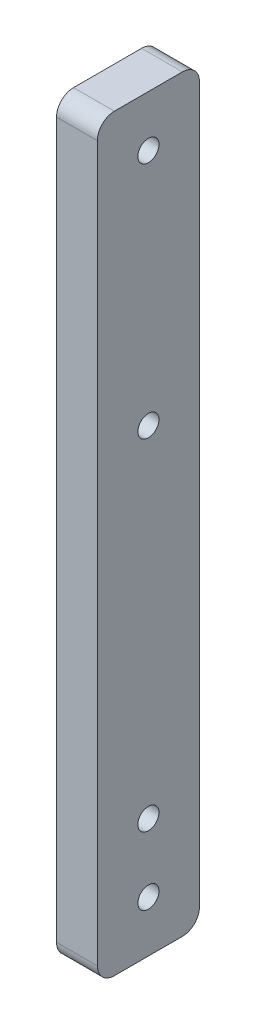
ISO-10303-21;
HEADER;
FILE_DESCRIPTION(('STEP AP214'),'2;1');
FILE_NAME('part.step','',(''),(''),'','','');
FILE_SCHEMA(('AUTOMOTIVE_DESIGN { 1 0 10303 214 1 1 1 1 }'));
ENDSEC;
DATA;
#1=APPLICATION_CONTEXT('core data for automotive mechanical design processes');
#2=APPLICATION_PROTOCOL_DEFINITION('international standard','automotive_design',2000,#1);
#3=PRODUCT_CONTEXT('',#1,'mechanical');
#4=PRODUCT('Part','Part','',(#3));
#5=PRODUCT_RELATED_PRODUCT_CATEGORY('part','',(#4));
#6=PRODUCT_DEFINITION_FORMATION('','',#4);
#7=PRODUCT_DEFINITION_CONTEXT('part definition',#1,'design');
#8=PRODUCT_DEFINITION('design','',#6,#7);
#9=PRODUCT_DEFINITION_SHAPE('','',#8);
#10=(LENGTH_UNIT() NAMED_UNIT(*) SI_UNIT(.MILLI.,.METRE.));
#11=(NAMED_UNIT(*) PLANE_ANGLE_UNIT() SI_UNIT($,.RADIAN.));
#12=(NAMED_UNIT(*) SI_UNIT($,.STERADIAN.) SOLID_ANGLE_UNIT());
#13=UNCERTAINTY_MEASURE_WITH_UNIT(LENGTH_MEASURE(1.E-05),#10,'distance_accuracy_value','');
#14=(GEOMETRIC_REPRESENTATION_CONTEXT(3) GLOBAL_UNCERTAINTY_ASSIGNED_CONTEXT((#13)) GLOBAL_UNIT_ASSIGNED_CONTEXT((#10,
#11,#12)) REPRESENTATION_CONTEXT('',''));
#15=CARTESIAN_POINT('',(0.,0.,0.));
#16=DIRECTION('',(0.,0.,1.));
#17=DIRECTION('',(1.,0.,0.));
#18=AXIS2_PLACEMENT_3D('',#15,#16,#17);
#19=CARTESIAN_POINT('',(12.,0.,0.));
#20=DIRECTION('',(1.,0.,0.));
#21=DIRECTION('',(0.,0.,-1.));
#22=AXIS2_PLACEMENT_3D('',#19,#20,#21);
#23=PLANE('',#22);
#24=CARTESIAN_POINT('',(12.,120.,0.));
#25=DIRECTION('',(1.,0.,0.));
#26=DIRECTION('',(0.,0.,-1.));
#27=AXIS2_PLACEMENT_3D('',#24,#25,#26);
#28=CIRCLE('',#27,3.1);
#29=CARTESIAN_POINT('',(12.,120.,-3.1));
#30=VERTEX_POINT('',#29);
#31=EDGE_CURVE('E230',#30,#30,#28,.T.);
#32=ORIENTED_EDGE('',*,*,#31,.F.);
#33=EDGE_LOOP('',(#32));
#34=FACE_BOUND('',#33,.T.);
#35=CARTESIAN_POINT('',(12.,0.,0.));
#36=DIRECTION('',(1.,0.,0.));
#37=DIRECTION('',(0.,0.,-1.));
#38=AXIS2_PLACEMENT_3D('',#35,#36,#37);
#39=CIRCLE('',#38,3.1);
#40=CARTESIAN_POINT('',(12.,0.,-3.1));
#41=VERTEX_POINT('',#40);
#42=EDGE_CURVE('E147',#41,#41,#39,.T.);
#43=ORIENTED_EDGE('',*,*,#42,.F.);
#44=EDGE_LOOP('',(#43));
#45=FACE_BOUND('',#44,.T.);
#46=DIRECTION('',(0.,-1.,0.));
#47=VECTOR('',#46,1.);
#48=CARTESIAN_POINT('',(12.,205.,15.));
#49=LINE('',#48,#47);
#50=CARTESIAN_POINT('',(12.,200.,15.));
#51=VERTEX_POINT('',#50);
#52=CARTESIAN_POINT('',(12.,-10.,15.));
#53=VERTEX_POINT('',#52);
#54=EDGE_CURVE('E153',#51,#53,#49,.T.);
#55=ORIENTED_EDGE('',*,*,#54,.T.);
#56=CARTESIAN_POINT('',(12.,-10.,9.99999999999998));
#57=DIRECTION('',(1.,0.,0.));
#58=DIRECTION('',(0.,0.,-1.));
#59=AXIS2_PLACEMENT_3D('',#56,#57,#58);
#60=CIRCLE('',#59,5.);
#61=CARTESIAN_POINT('',(12.,-15.,9.99999999999998));
#62=VERTEX_POINT('',#61);
#63=EDGE_CURVE('E177',#53,#62,#60,.T.);
#64=ORIENTED_EDGE('',*,*,#63,.T.);
#65=DIRECTION('',(0.,0.,-1.));
#66=VECTOR('',#65,1.);
#67=CARTESIAN_POINT('',(12.,-15.,15.));
#68=LINE('',#67,#66);
#69=CARTESIAN_POINT('',(12.,-15.,-9.99999999999999));
#70=VERTEX_POINT('',#69);
#71=EDGE_CURVE('E130',#62,#70,#68,.T.);
#72=ORIENTED_EDGE('',*,*,#71,.T.);
#73=CARTESIAN_POINT('',(12.,-10.,-9.99999999999999));
#74=DIRECTION('',(1.,0.,0.));
#75=DIRECTION('',(0.,0.,-1.));
#76=AXIS2_PLACEMENT_3D('',#73,#74,#75);
#77=CIRCLE('',#76,5.);
#78=CARTESIAN_POINT('',(12.,-10.,-15.));
#79=VERTEX_POINT('',#78);
#80=EDGE_CURVE('E174',#70,#79,#77,.T.);
#81=ORIENTED_EDGE('',*,*,#80,.T.);
#82=DIRECTION('',(0.,1.,0.));
#83=VECTOR('',#82,1.);
#84=CARTESIAN_POINT('',(12.,205.,-15.));
#85=LINE('',#84,#83);
#86=CARTESIAN_POINT('',(12.,200.,-15.));
#87=VERTEX_POINT('',#86);
#88=EDGE_CURVE('E203',#79,#87,#85,.T.);
#89=ORIENTED_EDGE('',*,*,#88,.T.);
#90=CARTESIAN_POINT('',(12.,200.,-10.));
#91=DIRECTION('',(1.,0.,0.));
#92=DIRECTION('',(0.,0.,-1.));
#93=AXIS2_PLACEMENT_3D('',#90,#91,#92);
#94=CIRCLE('',#93,5.);
#95=CARTESIAN_POINT('',(12.,205.,-10.));
#96=VERTEX_POINT('',#95);
#97=EDGE_CURVE('E64',#87,#96,#94,.T.);
#98=ORIENTED_EDGE('',*,*,#97,.T.);
#99=DIRECTION('',(0.,0.,1.));
#100=VECTOR('',#99,1.);
#101=CARTESIAN_POINT('',(12.,205.,15.));
#102=LINE('',#101,#100);
#103=CARTESIAN_POINT('',(12.,205.,10.));
#104=VERTEX_POINT('',#103);
#105=EDGE_CURVE('E155',#96,#104,#102,.T.);
#106=ORIENTED_EDGE('',*,*,#105,.T.);
#107=CARTESIAN_POINT('',(12.,200.,10.));
#108=DIRECTION('',(1.,0.,0.));
#109=DIRECTION('',(0.,0.,-1.));
#110=AXIS2_PLACEMENT_3D('',#107,#108,#109);
#111=CIRCLE('',#110,5.);
#112=EDGE_CURVE('E171',#104,#51,#111,.T.);
#113=ORIENTED_EDGE('',*,*,#112,.T.);
#114=EDGE_LOOP('',(#55,#64,#72,#81,#89,#98,#106,#113));
#115=FACE_BOUND('',#114,.T.);
#116=CARTESIAN_POINT('',(12.,20.,0.));
#117=DIRECTION('',(1.,0.,0.));
#118=DIRECTION('',(0.,0.,-1.));
#119=AXIS2_PLACEMENT_3D('',#116,#117,#118);
#120=CIRCLE('',#119,3.1);
#121=CARTESIAN_POINT('',(12.,20.,-3.1));
#122=VERTEX_POINT('',#121);
#123=EDGE_CURVE('E218',#122,#122,#120,.T.);
#124=ORIENTED_EDGE('',*,*,#123,.F.);
#125=EDGE_LOOP('',(#124));
#126=FACE_BOUND('',#125,.T.);
#127=CARTESIAN_POINT('',(12.,190.,0.));
#128=DIRECTION('',(1.,0.,0.));
#129=DIRECTION('',(0.,0.,-1.));
#130=AXIS2_PLACEMENT_3D('',#127,#128,#129);
#131=CIRCLE('',#130,3.1);
#132=CARTESIAN_POINT('',(12.,190.,-3.1));
#133=VERTEX_POINT('',#132);
#134=EDGE_CURVE('E221',#133,#133,#131,.T.);
#135=ORIENTED_EDGE('',*,*,#134,.F.);
#136=EDGE_LOOP('',(#135));
#137=FACE_BOUND('',#136,.T.);
#138=ADVANCED_FACE('F43',(#34,#45,#115,#126,#137),#23,.T.);
#139=CARTESIAN_POINT('',(0.,0.,0.));
#140=DIRECTION('',(1.,0.,0.));
#141=DIRECTION('',(0.,0.,-1.));
#142=AXIS2_PLACEMENT_3D('',#139,#140,#141);
#143=PLANE('',#142);
#144=DIRECTION('',(0.,0.,-1.));
#145=VECTOR('',#144,1.);
#146=CARTESIAN_POINT('',(0.,-15.,15.));
#147=LINE('',#146,#145);
#148=CARTESIAN_POINT('',(0.,-15.,9.99999999999998));
#149=VERTEX_POINT('',#148);
#150=CARTESIAN_POINT('',(0.,-15.,-9.99999999999999));
#151=VERTEX_POINT('',#150);
#152=EDGE_CURVE('E127',#149,#151,#147,.T.);
#153=ORIENTED_EDGE('',*,*,#152,.F.);
#154=CARTESIAN_POINT('',(0.,-10.,9.99999999999998));
#155=DIRECTION('',(1.,0.,0.));
#156=DIRECTION('',(0.,0.,-1.));
#157=AXIS2_PLACEMENT_3D('',#154,#155,#156);
#158=CIRCLE('',#157,5.);
#159=CARTESIAN_POINT('',(0.,-10.,15.));
#160=VERTEX_POINT('',#159);
#161=EDGE_CURVE('E109',#149,#160,#158,.F.);
#162=ORIENTED_EDGE('',*,*,#161,.T.);
#163=DIRECTION('',(0.,-1.,0.));
#164=VECTOR('',#163,1.);
#165=CARTESIAN_POINT('',(0.,205.,15.));
#166=LINE('',#165,#164);
#167=CARTESIAN_POINT('',(0.,200.,15.));
#168=VERTEX_POINT('',#167);
#169=EDGE_CURVE('E140',#168,#160,#166,.T.);
#170=ORIENTED_EDGE('',*,*,#169,.F.);
#171=CARTESIAN_POINT('',(0.,200.,10.));
#172=DIRECTION('',(1.,0.,0.));
#173=DIRECTION('',(0.,0.,-1.));
#174=AXIS2_PLACEMENT_3D('',#171,#172,#173);
#175=CIRCLE('',#174,5.);
#176=CARTESIAN_POINT('',(0.,205.,10.));
#177=VERTEX_POINT('',#176);
#178=EDGE_CURVE('E159',#168,#177,#175,.F.);
#179=ORIENTED_EDGE('',*,*,#178,.T.);
#180=DIRECTION('',(0.,0.,1.));
#181=VECTOR('',#180,1.);
#182=CARTESIAN_POINT('',(0.,205.,15.));
#183=LINE('',#182,#181);
#184=CARTESIAN_POINT('',(0.,205.,-10.));
#185=VERTEX_POINT('',#184);
#186=EDGE_CURVE('E145',#185,#177,#183,.T.);
#187=ORIENTED_EDGE('',*,*,#186,.F.);
#188=CARTESIAN_POINT('',(0.,200.,-10.));
#189=DIRECTION('',(1.,0.,0.));
#190=DIRECTION('',(0.,0.,-1.));
#191=AXIS2_PLACEMENT_3D('',#188,#189,#190);
#192=CIRCLE('',#191,5.);
#193=CARTESIAN_POINT('',(0.,200.,-15.));
#194=VERTEX_POINT('',#193);
#195=EDGE_CURVE('E132',#185,#194,#192,.F.);
#196=ORIENTED_EDGE('',*,*,#195,.T.);
#197=DIRECTION('',(0.,1.,0.));
#198=VECTOR('',#197,1.);
#199=CARTESIAN_POINT('',(0.,205.,-15.));
#200=LINE('',#199,#198);
#201=CARTESIAN_POINT('',(0.,-10.,-15.));
#202=VERTEX_POINT('',#201);
#203=EDGE_CURVE('E139',#202,#194,#200,.T.);
#204=ORIENTED_EDGE('',*,*,#203,.F.);
#205=CARTESIAN_POINT('',(0.,-10.,-9.99999999999999));
#206=DIRECTION('',(1.,0.,0.));
#207=DIRECTION('',(0.,0.,-1.));
#208=AXIS2_PLACEMENT_3D('',#205,#206,#207);
#209=CIRCLE('',#208,5.);
#210=EDGE_CURVE('E121',#202,#151,#209,.F.);
#211=ORIENTED_EDGE('',*,*,#210,.T.);
#212=EDGE_LOOP('',(#153,#162,#170,#179,#187,#196,#204,#211));
#213=FACE_BOUND('',#212,.T.);
#214=CARTESIAN_POINT('',(0.,0.,0.));
#215=DIRECTION('',(1.,0.,0.));
#216=DIRECTION('',(0.,0.,-1.));
#217=AXIS2_PLACEMENT_3D('',#214,#215,#216);
#218=CIRCLE('',#217,3.1);
#219=CARTESIAN_POINT('',(0.,0.,-3.1));
#220=VERTEX_POINT('',#219);
#221=EDGE_CURVE('E206',#220,#220,#218,.T.);
#222=ORIENTED_EDGE('',*,*,#221,.T.);
#223=EDGE_LOOP('',(#222));
#224=FACE_BOUND('',#223,.T.);
#225=CARTESIAN_POINT('',(0.,20.,0.));
#226=DIRECTION('',(1.,0.,0.));
#227=DIRECTION('',(0.,0.,-1.));
#228=AXIS2_PLACEMENT_3D('',#225,#226,#227);
#229=CIRCLE('',#228,3.1);
#230=CARTESIAN_POINT('',(0.,20.,-3.1));
#231=VERTEX_POINT('',#230);
#232=EDGE_CURVE('E237',#231,#231,#229,.T.);
#233=ORIENTED_EDGE('',*,*,#232,.T.);
#234=EDGE_LOOP('',(#233));
#235=FACE_BOUND('',#234,.T.);
#236=CARTESIAN_POINT('',(0.,120.,0.));
#237=DIRECTION('',(1.,0.,0.));
#238=DIRECTION('',(0.,0.,-1.));
#239=AXIS2_PLACEMENT_3D('',#236,#237,#238);
#240=CIRCLE('',#239,3.1);
#241=CARTESIAN_POINT('',(0.,120.,-3.1));
#242=VERTEX_POINT('',#241);
#243=EDGE_CURVE('E224',#242,#242,#240,.T.);
#244=ORIENTED_EDGE('',*,*,#243,.T.);
#245=EDGE_LOOP('',(#244));
#246=FACE_BOUND('',#245,.T.);
#247=CARTESIAN_POINT('',(0.,190.,0.));
#248=DIRECTION('',(1.,0.,0.));
#249=DIRECTION('',(0.,0.,-1.));
#250=AXIS2_PLACEMENT_3D('',#247,#248,#249);
#251=CIRCLE('',#250,3.1);
#252=CARTESIAN_POINT('',(0.,190.,-3.1));
#253=VERTEX_POINT('',#252);
#254=EDGE_CURVE('E225',#253,#253,#251,.T.);
#255=ORIENTED_EDGE('',*,*,#254,.T.);
#256=EDGE_LOOP('',(#255));
#257=FACE_BOUND('',#256,.T.);
#258=ADVANCED_FACE('F135',(#213,#224,#235,#246,#257),#143,.F.);
#259=CARTESIAN_POINT('',(12.,205.,15.));
#260=DIRECTION('',(0.,0.,-1.));
#261=DIRECTION('',(0.,1.,0.));
#262=AXIS2_PLACEMENT_3D('',#259,#260,#261);
#263=PLANE('',#262);
#264=ORIENTED_EDGE('',*,*,#169,.T.);
#265=DIRECTION('',(-1.,0.,0.));
#266=VECTOR('',#265,1.);
#267=CARTESIAN_POINT('',(12.,-10.,15.));
#268=LINE('',#267,#266);
#269=EDGE_CURVE('E114',#160,#53,#268,.F.);
#270=ORIENTED_EDGE('',*,*,#269,.T.);
#271=ORIENTED_EDGE('',*,*,#54,.F.);
#272=DIRECTION('',(-1.,0.,0.));
#273=VECTOR('',#272,1.);
#274=CARTESIAN_POINT('',(12.,200.,15.));
#275=LINE('',#274,#273);
#276=EDGE_CURVE('E120',#51,#168,#275,.T.);
#277=ORIENTED_EDGE('',*,*,#276,.T.);
#278=EDGE_LOOP('',(#264,#270,#271,#277));
#279=FACE_BOUND('',#278,.T.);
#280=ADVANCED_FACE('F198',(#279),#263,.F.);
#281=CARTESIAN_POINT('',(12.,-15.,15.));
#282=DIRECTION('',(0.,1.,0.));
#283=DIRECTION('',(0.,0.,1.));
#284=AXIS2_PLACEMENT_3D('',#281,#282,#283);
#285=PLANE('',#284);
#286=ORIENTED_EDGE('',*,*,#71,.F.);
#287=DIRECTION('',(-1.,0.,0.));
#288=VECTOR('',#287,1.);
#289=CARTESIAN_POINT('',(12.,-15.,9.99999999999998));
#290=LINE('',#289,#288);
#291=EDGE_CURVE('E113',#62,#149,#290,.T.);
#292=ORIENTED_EDGE('',*,*,#291,.T.);
#293=ORIENTED_EDGE('',*,*,#152,.T.);
#294=DIRECTION('',(-1.,0.,0.));
#295=VECTOR('',#294,1.);
#296=CARTESIAN_POINT('',(12.,-15.,-9.99999999999999));
#297=LINE('',#296,#295);
#298=EDGE_CURVE('E133',#151,#70,#297,.F.);
#299=ORIENTED_EDGE('',*,*,#298,.T.);
#300=EDGE_LOOP('',(#286,#292,#293,#299));
#301=FACE_BOUND('',#300,.T.);
#302=ADVANCED_FACE('F126',(#301),#285,.F.);
#303=CARTESIAN_POINT('',(12.,205.,-15.));
#304=DIRECTION('',(0.,0.,1.));
#305=DIRECTION('',(0.,-1.,0.));
#306=AXIS2_PLACEMENT_3D('',#303,#304,#305);
#307=PLANE('',#306);
#308=ORIENTED_EDGE('',*,*,#88,.F.);
#309=DIRECTION('',(-1.,0.,0.));
#310=VECTOR('',#309,1.);
#311=CARTESIAN_POINT('',(12.,-10.,-15.));
#312=LINE('',#311,#310);
#313=EDGE_CURVE('E183',#79,#202,#312,.T.);
#314=ORIENTED_EDGE('',*,*,#313,.T.);
#315=ORIENTED_EDGE('',*,*,#203,.T.);
#316=DIRECTION('',(-1.,0.,0.));
#317=VECTOR('',#316,1.);
#318=CARTESIAN_POINT('',(12.,200.,-15.));
#319=LINE('',#318,#317);
#320=EDGE_CURVE('E180',#194,#87,#319,.F.);
#321=ORIENTED_EDGE('',*,*,#320,.T.);
#322=EDGE_LOOP('',(#308,#314,#315,#321));
#323=FACE_BOUND('',#322,.T.);
#324=ADVANCED_FACE('F263',(#323),#307,.F.);
#325=CARTESIAN_POINT('',(12.,205.,15.));
#326=DIRECTION('',(0.,-1.,0.));
#327=DIRECTION('',(0.,0.,-1.));
#328=AXIS2_PLACEMENT_3D('',#325,#326,#327);
#329=PLANE('',#328);
#330=ORIENTED_EDGE('',*,*,#186,.T.);
#331=DIRECTION('',(-1.,0.,0.));
#332=VECTOR('',#331,1.);
#333=CARTESIAN_POINT('',(12.,205.,10.));
#334=LINE('',#333,#332);
#335=EDGE_CURVE('E11',#177,#104,#334,.F.);
#336=ORIENTED_EDGE('',*,*,#335,.T.);
#337=ORIENTED_EDGE('',*,*,#105,.F.);
#338=DIRECTION('',(-1.,0.,0.));
#339=VECTOR('',#338,1.);
#340=CARTESIAN_POINT('',(12.,205.,-10.));
#341=LINE('',#340,#339);
#342=EDGE_CURVE('E52',#96,#185,#341,.T.);
#343=ORIENTED_EDGE('',*,*,#342,.T.);
#344=EDGE_LOOP('',(#330,#336,#337,#343));
#345=FACE_BOUND('',#344,.T.);
#346=ADVANCED_FACE('F190',(#345),#329,.F.);
#347=CARTESIAN_POINT('',(12.,0.,0.));
#348=DIRECTION('',(-1.,0.,0.));
#349=DIRECTION('',(0.,0.,1.));
#350=AXIS2_PLACEMENT_3D('',#347,#348,#349);
#351=CYLINDRICAL_SURFACE('',#350,3.1);
#352=ORIENTED_EDGE('',*,*,#42,.T.);
#353=EDGE_LOOP('',(#352));
#354=FACE_BOUND('',#353,.T.);
#355=ORIENTED_EDGE('',*,*,#221,.F.);
#356=EDGE_LOOP('',(#355));
#357=FACE_BOUND('',#356,.T.);
#358=ADVANCED_FACE('F252',(#354,#357),#351,.F.);
#359=CARTESIAN_POINT('',(12.,20.,0.));
#360=DIRECTION('',(-1.,0.,0.));
#361=DIRECTION('',(0.,0.,1.));
#362=AXIS2_PLACEMENT_3D('',#359,#360,#361);
#363=CYLINDRICAL_SURFACE('',#362,3.1);
#364=ORIENTED_EDGE('',*,*,#123,.T.);
#365=EDGE_LOOP('',(#364));
#366=FACE_BOUND('',#365,.T.);
#367=ORIENTED_EDGE('',*,*,#232,.F.);
#368=EDGE_LOOP('',(#367));
#369=FACE_BOUND('',#368,.T.);
#370=ADVANCED_FACE('F254',(#366,#369),#363,.F.);
#371=CARTESIAN_POINT('',(12.,120.,0.));
#372=DIRECTION('',(-1.,0.,0.));
#373=DIRECTION('',(0.,0.,1.));
#374=AXIS2_PLACEMENT_3D('',#371,#372,#373);
#375=CYLINDRICAL_SURFACE('',#374,3.1);
#376=ORIENTED_EDGE('',*,*,#31,.T.);
#377=EDGE_LOOP('',(#376));
#378=FACE_BOUND('',#377,.T.);
#379=ORIENTED_EDGE('',*,*,#243,.F.);
#380=EDGE_LOOP('',(#379));
#381=FACE_BOUND('',#380,.T.);
#382=ADVANCED_FACE('F260',(#378,#381),#375,.F.);
#383=CARTESIAN_POINT('',(12.,190.,0.));
#384=DIRECTION('',(-1.,0.,0.));
#385=DIRECTION('',(0.,0.,1.));
#386=AXIS2_PLACEMENT_3D('',#383,#384,#385);
#387=CYLINDRICAL_SURFACE('',#386,3.1);
#388=ORIENTED_EDGE('',*,*,#134,.T.);
#389=EDGE_LOOP('',(#388));
#390=FACE_BOUND('',#389,.T.);
#391=ORIENTED_EDGE('',*,*,#254,.F.);
#392=EDGE_LOOP('',(#391));
#393=FACE_BOUND('',#392,.T.);
#394=ADVANCED_FACE('F279',(#390,#393),#387,.F.);
#395=CARTESIAN_POINT('',(12.,-10.,9.99999999999998));
#396=DIRECTION('',(-1.,0.,0.));
#397=DIRECTION('',(0.,0.,1.));
#398=AXIS2_PLACEMENT_3D('',#395,#396,#397);
#399=CYLINDRICAL_SURFACE('',#398,5.);
#400=ORIENTED_EDGE('',*,*,#63,.F.);
#401=ORIENTED_EDGE('',*,*,#269,.F.);
#402=ORIENTED_EDGE('',*,*,#161,.F.);
#403=ORIENTED_EDGE('',*,*,#291,.F.);
#404=EDGE_LOOP('',(#400,#401,#402,#403));
#405=FACE_BOUND('',#404,.T.);
#406=ADVANCED_FACE('F112',(#405),#399,.T.);
#407=CARTESIAN_POINT('',(12.,-10.,-9.99999999999999));
#408=DIRECTION('',(-1.,0.,0.));
#409=DIRECTION('',(0.,0.,1.));
#410=AXIS2_PLACEMENT_3D('',#407,#408,#409);
#411=CYLINDRICAL_SURFACE('',#410,5.);
#412=ORIENTED_EDGE('',*,*,#80,.F.);
#413=ORIENTED_EDGE('',*,*,#298,.F.);
#414=ORIENTED_EDGE('',*,*,#210,.F.);
#415=ORIENTED_EDGE('',*,*,#313,.F.);
#416=EDGE_LOOP('',(#412,#413,#414,#415));
#417=FACE_BOUND('',#416,.T.);
#418=ADVANCED_FACE('F278',(#417),#411,.T.);
#419=CARTESIAN_POINT('',(12.,200.,10.));
#420=DIRECTION('',(-1.,0.,0.));
#421=DIRECTION('',(0.,0.,1.));
#422=AXIS2_PLACEMENT_3D('',#419,#420,#421);
#423=CYLINDRICAL_SURFACE('',#422,5.);
#424=ORIENTED_EDGE('',*,*,#112,.F.);
#425=ORIENTED_EDGE('',*,*,#335,.F.);
#426=ORIENTED_EDGE('',*,*,#178,.F.);
#427=ORIENTED_EDGE('',*,*,#276,.F.);
#428=EDGE_LOOP('',(#424,#425,#426,#427));
#429=FACE_BOUND('',#428,.T.);
#430=ADVANCED_FACE('F195',(#429),#423,.T.);
#431=CARTESIAN_POINT('',(12.,200.,-10.));
#432=DIRECTION('',(-1.,0.,0.));
#433=DIRECTION('',(0.,0.,1.));
#434=AXIS2_PLACEMENT_3D('',#431,#432,#433);
#435=CYLINDRICAL_SURFACE('',#434,5.);
#436=ORIENTED_EDGE('',*,*,#97,.F.);
#437=ORIENTED_EDGE('',*,*,#320,.F.);
#438=ORIENTED_EDGE('',*,*,#195,.F.);
#439=ORIENTED_EDGE('',*,*,#342,.F.);
#440=EDGE_LOOP('',(#436,#437,#438,#439));
#441=FACE_BOUND('',#440,.T.);
#442=ADVANCED_FACE('F45',(#441),#435,.T.);
#443=CLOSED_SHELL('',(#138,#258,#280,#302,#324,#346,#358,#370,#382,#394,#406,#418,#430,#442));
#444=MANIFOLD_SOLID_BREP('B2',#443);
#445=ADVANCED_BREP_SHAPE_REPRESENTATION('',(#18,#444),#14);
#446=SHAPE_DEFINITION_REPRESENTATION(#9,#445);
ENDSEC;
END-ISO-10303-21;
